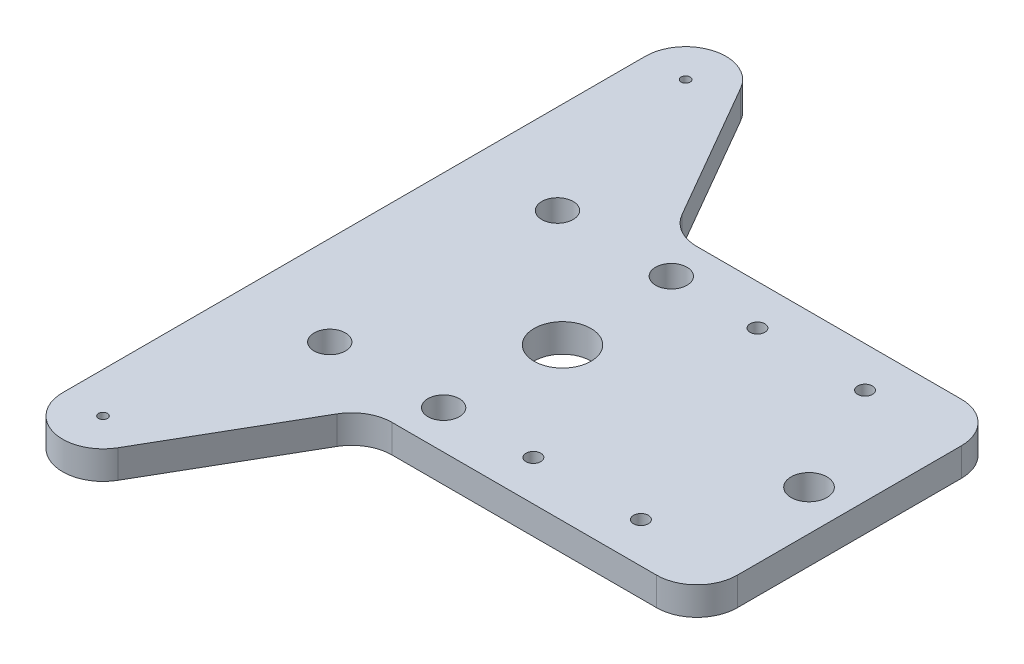
ISO-10303-21;
HEADER;
FILE_DESCRIPTION(('STEP AP214'),'2;1');
FILE_NAME('part.step','',(''),(''),'','','');
FILE_SCHEMA(('AUTOMOTIVE_DESIGN { 1 0 10303 214 1 1 1 1 }'));
ENDSEC;
DATA;
#1=APPLICATION_CONTEXT('core data for automotive mechanical design processes');
#2=APPLICATION_PROTOCOL_DEFINITION('international standard','automotive_design',2000,#1);
#3=PRODUCT_CONTEXT('',#1,'mechanical');
#4=PRODUCT('Part','Part','',(#3));
#5=PRODUCT_RELATED_PRODUCT_CATEGORY('part','',(#4));
#6=PRODUCT_DEFINITION_FORMATION('','',#4);
#7=PRODUCT_DEFINITION_CONTEXT('part definition',#1,'design');
#8=PRODUCT_DEFINITION('design','',#6,#7);
#9=PRODUCT_DEFINITION_SHAPE('','',#8);
#10=(LENGTH_UNIT() NAMED_UNIT(*) SI_UNIT(.MILLI.,.METRE.));
#11=(NAMED_UNIT(*) PLANE_ANGLE_UNIT() SI_UNIT($,.RADIAN.));
#12=(NAMED_UNIT(*) SI_UNIT($,.STERADIAN.) SOLID_ANGLE_UNIT());
#13=UNCERTAINTY_MEASURE_WITH_UNIT(LENGTH_MEASURE(1.E-05),#10,'distance_accuracy_value','');
#14=(GEOMETRIC_REPRESENTATION_CONTEXT(3) GLOBAL_UNCERTAINTY_ASSIGNED_CONTEXT((#13)) GLOBAL_UNIT_ASSIGNED_CONTEXT((#10,
#11,#12)) REPRESENTATION_CONTEXT('',''));
#15=CARTESIAN_POINT('',(0.,0.,0.));
#16=DIRECTION('',(0.,0.,1.));
#17=DIRECTION('',(1.,0.,0.));
#18=AXIS2_PLACEMENT_3D('',#15,#16,#17);
#19=CARTESIAN_POINT('',(9.,6.3,-65.));
#20=DIRECTION('',(0.,-1.,0.));
#21=DIRECTION('',(0.,0.,-1.));
#22=AXIS2_PLACEMENT_3D('',#19,#20,#21);
#23=PLANE('',#22);
#24=CARTESIAN_POINT('',(9.,6.3,-65.));
#25=DIRECTION('',(0.,1.,0.));
#26=DIRECTION('',(0.,0.,-1.));
#27=AXIS2_PLACEMENT_3D('',#24,#25,#26);
#28=CIRCLE('',#27,9.);
#29=CARTESIAN_POINT('',(16.7942286340599,6.3,-69.5));
#30=VERTEX_POINT('',#29);
#31=CARTESIAN_POINT('',(0.,6.3,-65.));
#32=VERTEX_POINT('',#31);
#33=EDGE_CURVE('E204',#30,#32,#28,.T.);
#34=ORIENTED_EDGE('',*,*,#33,.T.);
#35=DIRECTION('',(0.,0.,1.));
#36=VECTOR('',#35,1.);
#37=CARTESIAN_POINT('',(0.,6.3,65.));
#38=LINE('',#37,#36);
#39=CARTESIAN_POINT('',(0.,6.3,65.));
#40=VERTEX_POINT('',#39);
#41=EDGE_CURVE('E124',#32,#40,#38,.T.);
#42=ORIENTED_EDGE('',*,*,#41,.T.);
#43=CARTESIAN_POINT('',(9.00000000000003,6.3,65.));
#44=DIRECTION('',(0.,1.,0.));
#45=DIRECTION('',(0.,0.,1.));
#46=AXIS2_PLACEMENT_3D('',#43,#44,#45);
#47=CIRCLE('',#46,9.);
#48=CARTESIAN_POINT('',(16.79422863406,6.3,69.5));
#49=VERTEX_POINT('',#48);
#50=EDGE_CURVE('E216',#40,#49,#47,.T.);
#51=ORIENTED_EDGE('',*,*,#50,.T.);
#52=DIRECTION('',(0.500000000000003,0.,-0.866025403784437));
#53=VECTOR('',#52,1.);
#54=CARTESIAN_POINT('',(16.79422863406,6.3,69.5));
#55=LINE('',#54,#53);
#56=CARTESIAN_POINT('',(34.6920869789386,6.3,38.4999999999999));
#57=VERTEX_POINT('',#56);
#58=EDGE_CURVE('E219',#49,#57,#55,.T.);
#59=ORIENTED_EDGE('',*,*,#58,.T.);
#60=CARTESIAN_POINT('',(42.4863156129985,6.3,43.));
#61=DIRECTION('',(0.,-1.,0.));
#62=DIRECTION('',(0.,0.,-1.));
#63=AXIS2_PLACEMENT_3D('',#60,#61,#62);
#64=CIRCLE('',#63,9.);
#65=CARTESIAN_POINT('',(42.4863156129985,6.3,34.));
#66=VERTEX_POINT('',#65);
#67=EDGE_CURVE('E223',#57,#66,#64,.T.);
#68=ORIENTED_EDGE('',*,*,#67,.T.);
#69=DIRECTION('',(1.,0.,0.));
#70=VECTOR('',#69,1.);
#71=CARTESIAN_POINT('',(42.4863156129985,6.3,34.));
#72=LINE('',#71,#70);
#73=CARTESIAN_POINT('',(101.527767497326,6.3,34.));
#74=VERTEX_POINT('',#73);
#75=EDGE_CURVE('E227',#66,#74,#72,.T.);
#76=ORIENTED_EDGE('',*,*,#75,.T.);
#77=CARTESIAN_POINT('',(101.527767497326,6.3,25.));
#78=DIRECTION('',(0.,1.,0.));
#79=DIRECTION('',(0.,0.,1.));
#80=AXIS2_PLACEMENT_3D('',#77,#78,#79);
#81=CIRCLE('',#80,9.00000000000001);
#82=CARTESIAN_POINT('',(110.527767497326,6.3,24.9999999999999));
#83=VERTEX_POINT('',#82);
#84=EDGE_CURVE('E234',#74,#83,#81,.T.);
#85=ORIENTED_EDGE('',*,*,#84,.T.);
#86=DIRECTION('',(0.,0.,-1.));
#87=VECTOR('',#86,1.);
#88=CARTESIAN_POINT('',(110.527767497326,6.3,-25.));
#89=LINE('',#88,#87);
#90=CARTESIAN_POINT('',(110.527767497326,6.3,-25.));
#91=VERTEX_POINT('',#90);
#92=EDGE_CURVE('E237',#83,#91,#89,.T.);
#93=ORIENTED_EDGE('',*,*,#92,.T.);
#94=CARTESIAN_POINT('',(101.527767497326,6.3,-25.));
#95=DIRECTION('',(0.,1.,0.));
#96=DIRECTION('',(0.,0.,-1.));
#97=AXIS2_PLACEMENT_3D('',#94,#95,#96);
#98=CIRCLE('',#97,9.00000000000001);
#99=CARTESIAN_POINT('',(101.527767497326,6.3,-34.));
#100=VERTEX_POINT('',#99);
#101=EDGE_CURVE('E157',#91,#100,#98,.T.);
#102=ORIENTED_EDGE('',*,*,#101,.T.);
#103=DIRECTION('',(-1.,0.,0.));
#104=VECTOR('',#103,1.);
#105=CARTESIAN_POINT('',(42.4863156129985,6.3,-34.));
#106=LINE('',#105,#104);
#107=CARTESIAN_POINT('',(42.4863156129985,6.3,-34.));
#108=VERTEX_POINT('',#107);
#109=EDGE_CURVE('E151',#100,#108,#106,.T.);
#110=ORIENTED_EDGE('',*,*,#109,.T.);
#111=CARTESIAN_POINT('',(42.4863156129985,6.3,-43.));
#112=DIRECTION('',(0.,-1.,0.));
#113=DIRECTION('',(0.,0.,1.));
#114=AXIS2_PLACEMENT_3D('',#111,#112,#113);
#115=CIRCLE('',#114,9.);
#116=CARTESIAN_POINT('',(34.6920869789386,6.3,-38.5));
#117=VERTEX_POINT('',#116);
#118=EDGE_CURVE('E155',#108,#117,#115,.T.);
#119=ORIENTED_EDGE('',*,*,#118,.T.);
#120=DIRECTION('',(-0.500000000000004,0.,-0.866025403784436));
#121=VECTOR('',#120,1.);
#122=CARTESIAN_POINT('',(16.7942286340599,6.3,-69.5));
#123=LINE('',#122,#121);
#124=EDGE_CURVE('E65',#117,#30,#123,.T.);
#125=ORIENTED_EDGE('',*,*,#124,.T.);
#126=EDGE_LOOP('',(#34,#42,#51,#59,#68,#76,#85,#93,#102,#110,#119,#125));
#127=FACE_BOUND('',#126,.T.);
#128=CARTESIAN_POINT('',(9.,6.3,-65.));
#129=DIRECTION('',(0.,1.,0.));
#130=DIRECTION('',(0.,0.,1.));
#131=AXIS2_PLACEMENT_3D('',#128,#129,#130);
#132=CIRCLE('',#131,1.);
#133=CARTESIAN_POINT('',(9.,6.3,-64.));
#134=VERTEX_POINT('',#133);
#135=EDGE_CURVE('E191',#134,#134,#132,.T.);
#136=ORIENTED_EDGE('',*,*,#135,.F.);
#137=EDGE_LOOP('',(#136));
#138=FACE_BOUND('',#137,.T.);
#139=CARTESIAN_POINT('',(89.0277674973262,6.3,25.));
#140=DIRECTION('',(0.,1.,0.));
#141=DIRECTION('',(0.,0.,1.));
#142=AXIS2_PLACEMENT_3D('',#139,#140,#141);
#143=CIRCLE('',#142,1.65);
#144=CARTESIAN_POINT('',(89.0277674973262,6.3,26.65));
#145=VERTEX_POINT('',#144);
#146=EDGE_CURVE('E203',#145,#145,#143,.T.);
#147=ORIENTED_EDGE('',*,*,#146,.F.);
#148=EDGE_LOOP('',(#147));
#149=FACE_BOUND('',#148,.T.);
#150=CARTESIAN_POINT('',(9.00000000000003,6.3,65.));
#151=DIRECTION('',(0.,1.,0.));
#152=DIRECTION('',(0.,0.,-1.));
#153=AXIS2_PLACEMENT_3D('',#150,#151,#152);
#154=CIRCLE('',#153,1.);
#155=CARTESIAN_POINT('',(9.00000000000003,6.3,64.));
#156=VERTEX_POINT('',#155);
#157=EDGE_CURVE('E281',#156,#156,#154,.T.);
#158=ORIENTED_EDGE('',*,*,#157,.F.);
#159=EDGE_LOOP('',(#158));
#160=FACE_BOUND('',#159,.T.);
#161=CARTESIAN_POINT('',(46.5277674973261,6.3,0.));
#162=DIRECTION('',(0.,1.,0.));
#163=DIRECTION('',(0.,0.,-1.));
#164=AXIS2_PLACEMENT_3D('',#161,#162,#163);
#165=CIRCLE('',#164,6.35000000000061);
#166=CARTESIAN_POINT('',(46.5277674973261,6.3,-6.35000000000062));
#167=VERTEX_POINT('',#166);
#168=EDGE_CURVE('E288',#167,#167,#165,.T.);
#169=ORIENTED_EDGE('',*,*,#168,.F.);
#170=EDGE_LOOP('',(#169));
#171=FACE_BOUND('',#170,.T.);
#172=CARTESIAN_POINT('',(20.,6.3,-25.4));
#173=DIRECTION('',(0.,1.,0.));
#174=DIRECTION('',(0.,0.,1.));
#175=AXIS2_PLACEMENT_3D('',#172,#173,#174);
#176=CIRCLE('',#175,3.5);
#177=CARTESIAN_POINT('',(20.,6.3,-21.9));
#178=VERTEX_POINT('',#177);
#179=EDGE_CURVE('E296',#178,#178,#176,.T.);
#180=ORIENTED_EDGE('',*,*,#179,.F.);
#181=EDGE_LOOP('',(#180));
#182=FACE_BOUND('',#181,.T.);
#183=CARTESIAN_POINT('',(45.4,6.3,-25.4));
#184=DIRECTION('',(0.,1.,0.));
#185=DIRECTION('',(0.,0.,1.));
#186=AXIS2_PLACEMENT_3D('',#183,#184,#185);
#187=CIRCLE('',#186,3.5);
#188=CARTESIAN_POINT('',(45.4,6.3,-21.9));
#189=VERTEX_POINT('',#188);
#190=EDGE_CURVE('E304',#189,#189,#187,.T.);
#191=ORIENTED_EDGE('',*,*,#190,.F.);
#192=EDGE_LOOP('',(#191));
#193=FACE_BOUND('',#192,.T.);
#194=CARTESIAN_POINT('',(45.4,6.3,25.4));
#195=DIRECTION('',(0.,1.,0.));
#196=DIRECTION('',(0.,0.,-1.));
#197=AXIS2_PLACEMENT_3D('',#194,#195,#196);
#198=CIRCLE('',#197,3.5);
#199=CARTESIAN_POINT('',(45.4,6.3,21.9));
#200=VERTEX_POINT('',#199);
#201=EDGE_CURVE('E312',#200,#200,#198,.T.);
#202=ORIENTED_EDGE('',*,*,#201,.F.);
#203=EDGE_LOOP('',(#202));
#204=FACE_BOUND('',#203,.T.);
#205=CARTESIAN_POINT('',(20.,6.3,25.4));
#206=DIRECTION('',(0.,1.,0.));
#207=DIRECTION('',(0.,0.,-1.));
#208=AXIS2_PLACEMENT_3D('',#205,#206,#207);
#209=CIRCLE('',#208,3.49999999999999);
#210=CARTESIAN_POINT('',(20.,6.3,21.9));
#211=VERTEX_POINT('',#210);
#212=EDGE_CURVE('E320',#211,#211,#209,.T.);
#213=ORIENTED_EDGE('',*,*,#212,.F.);
#214=EDGE_LOOP('',(#213));
#215=FACE_BOUND('',#214,.T.);
#216=CARTESIAN_POINT('',(101.527767497326,6.3,0.));
#217=DIRECTION('',(0.,1.,0.));
#218=DIRECTION('',(0.,0.,-1.));
#219=AXIS2_PLACEMENT_3D('',#216,#217,#218);
#220=CIRCLE('',#219,4.00000000000062);
#221=CARTESIAN_POINT('',(101.527767497326,6.3,-4.00000000000065));
#222=VERTEX_POINT('',#221);
#223=EDGE_CURVE('E328',#222,#222,#220,.T.);
#224=ORIENTED_EDGE('',*,*,#223,.F.);
#225=EDGE_LOOP('',(#224));
#226=FACE_BOUND('',#225,.T.);
#227=CARTESIAN_POINT('',(65.0277674973262,6.3,25.));
#228=DIRECTION('',(0.,1.,0.));
#229=DIRECTION('',(0.,0.,1.));
#230=AXIS2_PLACEMENT_3D('',#227,#228,#229);
#231=CIRCLE('',#230,1.65);
#232=CARTESIAN_POINT('',(65.0277674973262,6.3,26.65));
#233=VERTEX_POINT('',#232);
#234=EDGE_CURVE('E336',#233,#233,#231,.T.);
#235=ORIENTED_EDGE('',*,*,#234,.F.);
#236=EDGE_LOOP('',(#235));
#237=FACE_BOUND('',#236,.T.);
#238=CARTESIAN_POINT('',(65.0277674973261,6.3,-25.));
#239=DIRECTION('',(0.,1.,0.));
#240=DIRECTION('',(0.,0.,-1.));
#241=AXIS2_PLACEMENT_3D('',#238,#239,#240);
#242=CIRCLE('',#241,1.65);
#243=CARTESIAN_POINT('',(65.0277674973261,6.3,-26.65));
#244=VERTEX_POINT('',#243);
#245=EDGE_CURVE('E344',#244,#244,#242,.T.);
#246=ORIENTED_EDGE('',*,*,#245,.F.);
#247=EDGE_LOOP('',(#246));
#248=FACE_BOUND('',#247,.T.);
#249=CARTESIAN_POINT('',(89.0277674973261,6.3,-25.));
#250=DIRECTION('',(0.,1.,0.));
#251=DIRECTION('',(0.,0.,-1.));
#252=AXIS2_PLACEMENT_3D('',#249,#250,#251);
#253=CIRCLE('',#252,1.65);
#254=CARTESIAN_POINT('',(89.0277674973261,6.3,-26.65));
#255=VERTEX_POINT('',#254);
#256=EDGE_CURVE('E352',#255,#255,#253,.T.);
#257=ORIENTED_EDGE('',*,*,#256,.F.);
#258=EDGE_LOOP('',(#257));
#259=FACE_BOUND('',#258,.T.);
#260=ADVANCED_FACE('F44',(#127,#138,#149,#160,#171,#182,#193,#204,#215,#226,#237,#248,#259),#23,.F.);
#261=CARTESIAN_POINT('',(9.,0.,-65.));
#262=DIRECTION('',(0.,-1.,0.));
#263=DIRECTION('',(0.,0.,-1.));
#264=AXIS2_PLACEMENT_3D('',#261,#262,#263);
#265=PLANE('',#264);
#266=CARTESIAN_POINT('',(65.0277674973261,0.,-25.));
#267=DIRECTION('',(0.,1.,0.));
#268=DIRECTION('',(0.,0.,-1.));
#269=AXIS2_PLACEMENT_3D('',#266,#267,#268);
#270=CIRCLE('',#269,1.65);
#271=CARTESIAN_POINT('',(65.0277674973261,0.,-26.65));
#272=VERTEX_POINT('',#271);
#273=EDGE_CURVE('E348',#272,#272,#270,.T.);
#274=ORIENTED_EDGE('',*,*,#273,.T.);
#275=EDGE_LOOP('',(#274));
#276=FACE_BOUND('',#275,.T.);
#277=CARTESIAN_POINT('',(101.527767497326,0.,0.));
#278=DIRECTION('',(0.,1.,0.));
#279=DIRECTION('',(0.,0.,-1.));
#280=AXIS2_PLACEMENT_3D('',#277,#278,#279);
#281=CIRCLE('',#280,4.00000000000062);
#282=CARTESIAN_POINT('',(101.527767497326,0.,-4.00000000000065));
#283=VERTEX_POINT('',#282);
#284=EDGE_CURVE('E332',#283,#283,#281,.T.);
#285=ORIENTED_EDGE('',*,*,#284,.T.);
#286=EDGE_LOOP('',(#285));
#287=FACE_BOUND('',#286,.T.);
#288=CARTESIAN_POINT('',(45.4,0.,25.4));
#289=DIRECTION('',(0.,1.,0.));
#290=DIRECTION('',(0.,0.,-1.));
#291=AXIS2_PLACEMENT_3D('',#288,#289,#290);
#292=CIRCLE('',#291,3.5);
#293=CARTESIAN_POINT('',(45.4,0.,21.9));
#294=VERTEX_POINT('',#293);
#295=EDGE_CURVE('E316',#294,#294,#292,.T.);
#296=ORIENTED_EDGE('',*,*,#295,.T.);
#297=EDGE_LOOP('',(#296));
#298=FACE_BOUND('',#297,.T.);
#299=CARTESIAN_POINT('',(20.,0.,-25.4));
#300=DIRECTION('',(0.,1.,0.));
#301=DIRECTION('',(0.,0.,1.));
#302=AXIS2_PLACEMENT_3D('',#299,#300,#301);
#303=CIRCLE('',#302,3.5);
#304=CARTESIAN_POINT('',(20.,0.,-21.9));
#305=VERTEX_POINT('',#304);
#306=EDGE_CURVE('E300',#305,#305,#303,.T.);
#307=ORIENTED_EDGE('',*,*,#306,.T.);
#308=EDGE_LOOP('',(#307));
#309=FACE_BOUND('',#308,.T.);
#310=CARTESIAN_POINT('',(9.00000000000003,0.,65.));
#311=DIRECTION('',(0.,1.,0.));
#312=DIRECTION('',(0.,0.,-1.));
#313=AXIS2_PLACEMENT_3D('',#310,#311,#312);
#314=CIRCLE('',#313,1.);
#315=CARTESIAN_POINT('',(9.00000000000003,0.,64.));
#316=VERTEX_POINT('',#315);
#317=EDGE_CURVE('E284',#316,#316,#314,.T.);
#318=ORIENTED_EDGE('',*,*,#317,.T.);
#319=EDGE_LOOP('',(#318));
#320=FACE_BOUND('',#319,.T.);
#321=CARTESIAN_POINT('',(9.,0.,-65.));
#322=DIRECTION('',(0.,1.,0.));
#323=DIRECTION('',(0.,0.,1.));
#324=AXIS2_PLACEMENT_3D('',#321,#322,#323);
#325=CIRCLE('',#324,1.);
#326=CARTESIAN_POINT('',(9.,0.,-64.));
#327=VERTEX_POINT('',#326);
#328=EDGE_CURVE('E198',#327,#327,#325,.T.);
#329=ORIENTED_EDGE('',*,*,#328,.T.);
#330=EDGE_LOOP('',(#329));
#331=FACE_BOUND('',#330,.T.);
#332=CARTESIAN_POINT('',(9.,0.,-65.));
#333=DIRECTION('',(0.,1.,0.));
#334=DIRECTION('',(0.,0.,-1.));
#335=AXIS2_PLACEMENT_3D('',#332,#333,#334);
#336=CIRCLE('',#335,9.);
#337=CARTESIAN_POINT('',(16.7942286340599,0.,-69.5));
#338=VERTEX_POINT('',#337);
#339=CARTESIAN_POINT('',(0.,0.,-65.));
#340=VERTEX_POINT('',#339);
#341=EDGE_CURVE('E197',#338,#340,#336,.T.);
#342=ORIENTED_EDGE('',*,*,#341,.F.);
#343=DIRECTION('',(-0.500000000000004,0.,-0.866025403784436));
#344=VECTOR('',#343,1.);
#345=CARTESIAN_POINT('',(16.7942286340599,0.,-69.5));
#346=LINE('',#345,#344);
#347=CARTESIAN_POINT('',(34.6920869789386,0.,-38.5));
#348=VERTEX_POINT('',#347);
#349=EDGE_CURVE('E116',#348,#338,#346,.T.);
#350=ORIENTED_EDGE('',*,*,#349,.F.);
#351=CARTESIAN_POINT('',(42.4863156129985,0.,-43.));
#352=DIRECTION('',(0.,-1.,0.));
#353=DIRECTION('',(0.,0.,1.));
#354=AXIS2_PLACEMENT_3D('',#351,#352,#353);
#355=CIRCLE('',#354,9.);
#356=CARTESIAN_POINT('',(42.4863156129985,0.,-34.));
#357=VERTEX_POINT('',#356);
#358=EDGE_CURVE('E110',#357,#348,#355,.T.);
#359=ORIENTED_EDGE('',*,*,#358,.F.);
#360=DIRECTION('',(-1.,0.,0.));
#361=VECTOR('',#360,1.);
#362=CARTESIAN_POINT('',(42.4863156129985,0.,-34.));
#363=LINE('',#362,#361);
#364=CARTESIAN_POINT('',(101.527767497326,0.,-34.));
#365=VERTEX_POINT('',#364);
#366=EDGE_CURVE('E166',#365,#357,#363,.T.);
#367=ORIENTED_EDGE('',*,*,#366,.F.);
#368=CARTESIAN_POINT('',(101.527767497326,0.,-25.));
#369=DIRECTION('',(0.,1.,0.));
#370=DIRECTION('',(0.,0.,-1.));
#371=AXIS2_PLACEMENT_3D('',#368,#369,#370);
#372=CIRCLE('',#371,9.00000000000001);
#373=CARTESIAN_POINT('',(110.527767497326,0.,-25.));
#374=VERTEX_POINT('',#373);
#375=EDGE_CURVE('E250',#374,#365,#372,.T.);
#376=ORIENTED_EDGE('',*,*,#375,.F.);
#377=DIRECTION('',(0.,0.,-1.));
#378=VECTOR('',#377,1.);
#379=CARTESIAN_POINT('',(110.527767497326,0.,-25.));
#380=LINE('',#379,#378);
#381=CARTESIAN_POINT('',(110.527767497326,0.,24.9999999999999));
#382=VERTEX_POINT('',#381);
#383=EDGE_CURVE('E253',#382,#374,#380,.T.);
#384=ORIENTED_EDGE('',*,*,#383,.F.);
#385=CARTESIAN_POINT('',(101.527767497326,0.,25.));
#386=DIRECTION('',(0.,1.,0.));
#387=DIRECTION('',(0.,0.,1.));
#388=AXIS2_PLACEMENT_3D('',#385,#386,#387);
#389=CIRCLE('',#388,9.00000000000001);
#390=CARTESIAN_POINT('',(101.527767497326,0.,34.));
#391=VERTEX_POINT('',#390);
#392=EDGE_CURVE('E256',#391,#382,#389,.T.);
#393=ORIENTED_EDGE('',*,*,#392,.F.);
#394=DIRECTION('',(1.,0.,0.));
#395=VECTOR('',#394,1.);
#396=CARTESIAN_POINT('',(42.4863156129985,0.,34.));
#397=LINE('',#396,#395);
#398=CARTESIAN_POINT('',(42.4863156129985,0.,34.));
#399=VERTEX_POINT('',#398);
#400=EDGE_CURVE('E259',#399,#391,#397,.T.);
#401=ORIENTED_EDGE('',*,*,#400,.F.);
#402=CARTESIAN_POINT('',(42.4863156129985,0.,43.));
#403=DIRECTION('',(0.,-1.,0.));
#404=DIRECTION('',(0.,0.,-1.));
#405=AXIS2_PLACEMENT_3D('',#402,#403,#404);
#406=CIRCLE('',#405,9.);
#407=CARTESIAN_POINT('',(34.6920869789386,0.,38.4999999999999));
#408=VERTEX_POINT('',#407);
#409=EDGE_CURVE('E262',#408,#399,#406,.T.);
#410=ORIENTED_EDGE('',*,*,#409,.F.);
#411=DIRECTION('',(0.500000000000003,0.,-0.866025403784437));
#412=VECTOR('',#411,1.);
#413=CARTESIAN_POINT('',(16.79422863406,0.,69.5));
#414=LINE('',#413,#412);
#415=CARTESIAN_POINT('',(16.79422863406,0.,69.5));
#416=VERTEX_POINT('',#415);
#417=EDGE_CURVE('E265',#416,#408,#414,.T.);
#418=ORIENTED_EDGE('',*,*,#417,.F.);
#419=CARTESIAN_POINT('',(9.00000000000003,0.,65.));
#420=DIRECTION('',(0.,1.,0.));
#421=DIRECTION('',(0.,0.,1.));
#422=AXIS2_PLACEMENT_3D('',#419,#420,#421);
#423=CIRCLE('',#422,9.);
#424=CARTESIAN_POINT('',(0.,0.,65.));
#425=VERTEX_POINT('',#424);
#426=EDGE_CURVE('E268',#425,#416,#423,.T.);
#427=ORIENTED_EDGE('',*,*,#426,.F.);
#428=DIRECTION('',(0.,0.,1.));
#429=VECTOR('',#428,1.);
#430=CARTESIAN_POINT('',(0.,0.,65.));
#431=LINE('',#430,#429);
#432=EDGE_CURVE('E271',#340,#425,#431,.T.);
#433=ORIENTED_EDGE('',*,*,#432,.F.);
#434=EDGE_LOOP('',(#342,#350,#359,#367,#376,#384,#393,#401,#410,#418,#427,#433));
#435=FACE_BOUND('',#434,.T.);
#436=CARTESIAN_POINT('',(89.0277674973262,0.,25.));
#437=DIRECTION('',(0.,1.,0.));
#438=DIRECTION('',(0.,0.,1.));
#439=AXIS2_PLACEMENT_3D('',#436,#437,#438);
#440=CIRCLE('',#439,1.65);
#441=CARTESIAN_POINT('',(89.0277674973262,0.,26.65));
#442=VERTEX_POINT('',#441);
#443=EDGE_CURVE('E199',#442,#442,#440,.T.);
#444=ORIENTED_EDGE('',*,*,#443,.T.);
#445=EDGE_LOOP('',(#444));
#446=FACE_BOUND('',#445,.T.);
#447=CARTESIAN_POINT('',(46.5277674973261,0.,0.));
#448=DIRECTION('',(0.,1.,0.));
#449=DIRECTION('',(0.,0.,-1.));
#450=AXIS2_PLACEMENT_3D('',#447,#448,#449);
#451=CIRCLE('',#450,6.35000000000061);
#452=CARTESIAN_POINT('',(46.5277674973261,0.,-6.35000000000062));
#453=VERTEX_POINT('',#452);
#454=EDGE_CURVE('E292',#453,#453,#451,.T.);
#455=ORIENTED_EDGE('',*,*,#454,.T.);
#456=EDGE_LOOP('',(#455));
#457=FACE_BOUND('',#456,.T.);
#458=CARTESIAN_POINT('',(45.4,0.,-25.4));
#459=DIRECTION('',(0.,1.,0.));
#460=DIRECTION('',(0.,0.,1.));
#461=AXIS2_PLACEMENT_3D('',#458,#459,#460);
#462=CIRCLE('',#461,3.5);
#463=CARTESIAN_POINT('',(45.4,0.,-21.9));
#464=VERTEX_POINT('',#463);
#465=EDGE_CURVE('E308',#464,#464,#462,.T.);
#466=ORIENTED_EDGE('',*,*,#465,.T.);
#467=EDGE_LOOP('',(#466));
#468=FACE_BOUND('',#467,.T.);
#469=CARTESIAN_POINT('',(20.,0.,25.4));
#470=DIRECTION('',(0.,1.,0.));
#471=DIRECTION('',(0.,0.,-1.));
#472=AXIS2_PLACEMENT_3D('',#469,#470,#471);
#473=CIRCLE('',#472,3.49999999999999);
#474=CARTESIAN_POINT('',(20.,0.,21.9));
#475=VERTEX_POINT('',#474);
#476=EDGE_CURVE('E324',#475,#475,#473,.T.);
#477=ORIENTED_EDGE('',*,*,#476,.T.);
#478=EDGE_LOOP('',(#477));
#479=FACE_BOUND('',#478,.T.);
#480=CARTESIAN_POINT('',(65.0277674973262,0.,25.));
#481=DIRECTION('',(0.,1.,0.));
#482=DIRECTION('',(0.,0.,1.));
#483=AXIS2_PLACEMENT_3D('',#480,#481,#482);
#484=CIRCLE('',#483,1.65);
#485=CARTESIAN_POINT('',(65.0277674973262,0.,26.65));
#486=VERTEX_POINT('',#485);
#487=EDGE_CURVE('E340',#486,#486,#484,.T.);
#488=ORIENTED_EDGE('',*,*,#487,.T.);
#489=EDGE_LOOP('',(#488));
#490=FACE_BOUND('',#489,.T.);
#491=CARTESIAN_POINT('',(89.0277674973261,0.,-25.));
#492=DIRECTION('',(0.,1.,0.));
#493=DIRECTION('',(0.,0.,-1.));
#494=AXIS2_PLACEMENT_3D('',#491,#492,#493);
#495=CIRCLE('',#494,1.65);
#496=CARTESIAN_POINT('',(89.0277674973261,0.,-26.65));
#497=VERTEX_POINT('',#496);
#498=EDGE_CURVE('E356',#497,#497,#495,.T.);
#499=ORIENTED_EDGE('',*,*,#498,.T.);
#500=EDGE_LOOP('',(#499));
#501=FACE_BOUND('',#500,.T.);
#502=ADVANCED_FACE('F379',(#276,#287,#298,#309,#320,#331,#435,#446,#457,#468,#479,#490,#501),
#265,.T.);
#503=CARTESIAN_POINT('',(9.,6.3,-65.));
#504=DIRECTION('',(0.,-1.,0.));
#505=DIRECTION('',(0.,0.,-1.));
#506=AXIS2_PLACEMENT_3D('',#503,#504,#505);
#507=CYLINDRICAL_SURFACE('',#506,9.);
#508=ORIENTED_EDGE('',*,*,#341,.T.);
#509=DIRECTION('',(0.,-1.,0.));
#510=VECTOR('',#509,1.);
#511=CARTESIAN_POINT('',(0.,6.3,-65.));
#512=LINE('',#511,#510);
#513=EDGE_CURVE('E12',#32,#340,#512,.T.);
#514=ORIENTED_EDGE('',*,*,#513,.F.);
#515=ORIENTED_EDGE('',*,*,#33,.F.);
#516=DIRECTION('',(0.,-1.,0.));
#517=VECTOR('',#516,1.);
#518=CARTESIAN_POINT('',(16.7942286340599,6.3,-69.5));
#519=LINE('',#518,#517);
#520=EDGE_CURVE('E175',#30,#338,#519,.T.);
#521=ORIENTED_EDGE('',*,*,#520,.T.);
#522=EDGE_LOOP('',(#508,#514,#515,#521));
#523=FACE_BOUND('',#522,.T.);
#524=ADVANCED_FACE('F46',(#523),#507,.T.);
#525=CARTESIAN_POINT('',(0.,6.3,65.));
#526=DIRECTION('',(1.,0.,0.));
#527=DIRECTION('',(0.,0.,-1.));
#528=AXIS2_PLACEMENT_3D('',#525,#526,#527);
#529=PLANE('',#528);
#530=ORIENTED_EDGE('',*,*,#432,.T.);
#531=DIRECTION('',(0.,-1.,0.));
#532=VECTOR('',#531,1.);
#533=CARTESIAN_POINT('',(0.,6.3,65.));
#534=LINE('',#533,#532);
#535=EDGE_CURVE('E54',#40,#425,#534,.T.);
#536=ORIENTED_EDGE('',*,*,#535,.F.);
#537=ORIENTED_EDGE('',*,*,#41,.F.);
#538=ORIENTED_EDGE('',*,*,#513,.T.);
#539=EDGE_LOOP('',(#530,#536,#537,#538));
#540=FACE_BOUND('',#539,.T.);
#541=ADVANCED_FACE('F436',(#540),#529,.F.);
#542=CARTESIAN_POINT('',(9.00000000000003,6.3,65.));
#543=DIRECTION('',(0.,-1.,0.));
#544=DIRECTION('',(0.,0.,-1.));
#545=AXIS2_PLACEMENT_3D('',#542,#543,#544);
#546=CYLINDRICAL_SURFACE('',#545,9.);
#547=ORIENTED_EDGE('',*,*,#426,.T.);
#548=DIRECTION('',(0.,-1.,0.));
#549=VECTOR('',#548,1.);
#550=CARTESIAN_POINT('',(16.79422863406,6.3,69.5));
#551=LINE('',#550,#549);
#552=EDGE_CURVE('E452',#49,#416,#551,.T.);
#553=ORIENTED_EDGE('',*,*,#552,.F.);
#554=ORIENTED_EDGE('',*,*,#50,.F.);
#555=ORIENTED_EDGE('',*,*,#535,.T.);
#556=EDGE_LOOP('',(#547,#553,#554,#555));
#557=FACE_BOUND('',#556,.T.);
#558=ADVANCED_FACE('F433',(#557),#546,.T.);
#559=CARTESIAN_POINT('',(16.79422863406,6.3,69.5));
#560=DIRECTION('',(-0.866025403784437,0.,-0.500000000000004));
#561=DIRECTION('',(-0.500000000000004,0.,0.866025403784437));
#562=AXIS2_PLACEMENT_3D('',#559,#560,#561);
#563=PLANE('',#562);
#564=ORIENTED_EDGE('',*,*,#417,.T.);
#565=DIRECTION('',(0.,-1.,0.));
#566=VECTOR('',#565,1.);
#567=CARTESIAN_POINT('',(34.6920869789386,6.3,38.4999999999999));
#568=LINE('',#567,#566);
#569=EDGE_CURVE('E460',#57,#408,#568,.T.);
#570=ORIENTED_EDGE('',*,*,#569,.F.);
#571=ORIENTED_EDGE('',*,*,#58,.F.);
#572=ORIENTED_EDGE('',*,*,#552,.T.);
#573=EDGE_LOOP('',(#564,#570,#571,#572));
#574=FACE_BOUND('',#573,.T.);
#575=ADVANCED_FACE('F429',(#574),#563,.F.);
#576=CARTESIAN_POINT('',(42.4863156129985,6.3,43.));
#577=DIRECTION('',(0.,-1.,0.));
#578=DIRECTION('',(0.,0.,-1.));
#579=AXIS2_PLACEMENT_3D('',#576,#577,#578);
#580=CYLINDRICAL_SURFACE('',#579,9.);
#581=ORIENTED_EDGE('',*,*,#409,.T.);
#582=DIRECTION('',(0.,-1.,0.));
#583=VECTOR('',#582,1.);
#584=CARTESIAN_POINT('',(42.4863156129985,6.3,34.));
#585=LINE('',#584,#583);
#586=EDGE_CURVE('E465',#66,#399,#585,.T.);
#587=ORIENTED_EDGE('',*,*,#586,.F.);
#588=ORIENTED_EDGE('',*,*,#67,.F.);
#589=ORIENTED_EDGE('',*,*,#569,.T.);
#590=EDGE_LOOP('',(#581,#587,#588,#589));
#591=FACE_BOUND('',#590,.T.);
#592=ADVANCED_FACE('F425',(#591),#580,.F.);
#593=CARTESIAN_POINT('',(42.4863156129985,6.3,34.));
#594=DIRECTION('',(0.,0.,-1.));
#595=DIRECTION('',(-1.,0.,0.));
#596=AXIS2_PLACEMENT_3D('',#593,#594,#595);
#597=PLANE('',#596);
#598=ORIENTED_EDGE('',*,*,#400,.T.);
#599=DIRECTION('',(0.,-1.,0.));
#600=VECTOR('',#599,1.);
#601=CARTESIAN_POINT('',(101.527767497326,6.3,34.));
#602=LINE('',#601,#600);
#603=EDGE_CURVE('E470',#74,#391,#602,.T.);
#604=ORIENTED_EDGE('',*,*,#603,.F.);
#605=ORIENTED_EDGE('',*,*,#75,.F.);
#606=ORIENTED_EDGE('',*,*,#586,.T.);
#607=EDGE_LOOP('',(#598,#604,#605,#606));
#608=FACE_BOUND('',#607,.T.);
#609=ADVANCED_FACE('F421',(#608),#597,.F.);
#610=CARTESIAN_POINT('',(101.527767497326,6.3,25.));
#611=DIRECTION('',(0.,-1.,0.));
#612=DIRECTION('',(0.,0.,-1.));
#613=AXIS2_PLACEMENT_3D('',#610,#611,#612);
#614=CYLINDRICAL_SURFACE('',#613,9.00000000000001);
#615=ORIENTED_EDGE('',*,*,#392,.T.);
#616=DIRECTION('',(0.,-1.,0.));
#617=VECTOR('',#616,1.);
#618=CARTESIAN_POINT('',(110.527767497326,6.3,24.9999999999999));
#619=LINE('',#618,#617);
#620=EDGE_CURVE('E476',#83,#382,#619,.T.);
#621=ORIENTED_EDGE('',*,*,#620,.F.);
#622=ORIENTED_EDGE('',*,*,#84,.F.);
#623=ORIENTED_EDGE('',*,*,#603,.T.);
#624=EDGE_LOOP('',(#615,#621,#622,#623));
#625=FACE_BOUND('',#624,.T.);
#626=ADVANCED_FACE('F417',(#625),#614,.T.);
#627=CARTESIAN_POINT('',(110.527767497326,6.3,-25.));
#628=DIRECTION('',(-1.,0.,0.));
#629=DIRECTION('',(0.,0.,1.));
#630=AXIS2_PLACEMENT_3D('',#627,#628,#629);
#631=PLANE('',#630);
#632=ORIENTED_EDGE('',*,*,#383,.T.);
#633=DIRECTION('',(0.,-1.,0.));
#634=VECTOR('',#633,1.);
#635=CARTESIAN_POINT('',(110.527767497326,6.3,-25.));
#636=LINE('',#635,#634);
#637=EDGE_CURVE('E480',#91,#374,#636,.T.);
#638=ORIENTED_EDGE('',*,*,#637,.F.);
#639=ORIENTED_EDGE('',*,*,#92,.F.);
#640=ORIENTED_EDGE('',*,*,#620,.T.);
#641=EDGE_LOOP('',(#632,#638,#639,#640));
#642=FACE_BOUND('',#641,.T.);
#643=ADVANCED_FACE('F413',(#642),#631,.F.);
#644=CARTESIAN_POINT('',(101.527767497326,6.3,-25.));
#645=DIRECTION('',(0.,-1.,0.));
#646=DIRECTION('',(0.,0.,-1.));
#647=AXIS2_PLACEMENT_3D('',#644,#645,#646);
#648=CYLINDRICAL_SURFACE('',#647,9.00000000000001);
#649=ORIENTED_EDGE('',*,*,#375,.T.);
#650=DIRECTION('',(0.,-1.,0.));
#651=VECTOR('',#650,1.);
#652=CARTESIAN_POINT('',(101.527767497326,6.3,-34.));
#653=LINE('',#652,#651);
#654=EDGE_CURVE('E168',#100,#365,#653,.T.);
#655=ORIENTED_EDGE('',*,*,#654,.F.);
#656=ORIENTED_EDGE('',*,*,#101,.F.);
#657=ORIENTED_EDGE('',*,*,#637,.T.);
#658=EDGE_LOOP('',(#649,#655,#656,#657));
#659=FACE_BOUND('',#658,.T.);
#660=ADVANCED_FACE('F410',(#659),#648,.T.);
#661=CARTESIAN_POINT('',(42.4863156129985,6.3,-34.));
#662=DIRECTION('',(0.,0.,1.));
#663=DIRECTION('',(1.,0.,0.));
#664=AXIS2_PLACEMENT_3D('',#661,#662,#663);
#665=PLANE('',#664);
#666=ORIENTED_EDGE('',*,*,#366,.T.);
#667=DIRECTION('',(0.,-1.,0.));
#668=VECTOR('',#667,1.);
#669=CARTESIAN_POINT('',(42.4863156129985,6.3,-34.));
#670=LINE('',#669,#668);
#671=EDGE_CURVE('E163',#108,#357,#670,.T.);
#672=ORIENTED_EDGE('',*,*,#671,.F.);
#673=ORIENTED_EDGE('',*,*,#109,.F.);
#674=ORIENTED_EDGE('',*,*,#654,.T.);
#675=EDGE_LOOP('',(#666,#672,#673,#674));
#676=FACE_BOUND('',#675,.T.);
#677=ADVANCED_FACE('F164',(#676),#665,.F.);
#678=CARTESIAN_POINT('',(42.4863156129985,6.3,-43.));
#679=DIRECTION('',(0.,-1.,0.));
#680=DIRECTION('',(0.,0.,-1.));
#681=AXIS2_PLACEMENT_3D('',#678,#679,#680);
#682=CYLINDRICAL_SURFACE('',#681,9.);
#683=ORIENTED_EDGE('',*,*,#358,.T.);
#684=DIRECTION('',(0.,-1.,0.));
#685=VECTOR('',#684,1.);
#686=CARTESIAN_POINT('',(34.6920869789386,6.3,-38.5));
#687=LINE('',#686,#685);
#688=EDGE_CURVE('E169',#117,#348,#687,.T.);
#689=ORIENTED_EDGE('',*,*,#688,.F.);
#690=ORIENTED_EDGE('',*,*,#118,.F.);
#691=ORIENTED_EDGE('',*,*,#671,.T.);
#692=EDGE_LOOP('',(#683,#689,#690,#691));
#693=FACE_BOUND('',#692,.T.);
#694=ADVANCED_FACE('F171',(#693),#682,.F.);
#695=CARTESIAN_POINT('',(16.7942286340599,6.3,-69.5));
#696=DIRECTION('',(-0.866025403784436,0.,0.500000000000004));
#697=DIRECTION('',(0.500000000000004,0.,0.866025403784436));
#698=AXIS2_PLACEMENT_3D('',#695,#696,#697);
#699=PLANE('',#698);
#700=ORIENTED_EDGE('',*,*,#349,.T.);
#701=ORIENTED_EDGE('',*,*,#520,.F.);
#702=ORIENTED_EDGE('',*,*,#124,.F.);
#703=ORIENTED_EDGE('',*,*,#688,.T.);
#704=EDGE_LOOP('',(#700,#701,#702,#703));
#705=FACE_BOUND('',#704,.T.);
#706=ADVANCED_FACE('F403',(#705),#699,.F.);
#707=CARTESIAN_POINT('',(9.,6.3,-65.));
#708=DIRECTION('',(0.,-1.,0.));
#709=DIRECTION('',(0.,0.,-1.));
#710=AXIS2_PLACEMENT_3D('',#707,#708,#709);
#711=CYLINDRICAL_SURFACE('',#710,1.);
#712=ORIENTED_EDGE('',*,*,#135,.T.);
#713=EDGE_LOOP('',(#712));
#714=FACE_BOUND('',#713,.T.);
#715=ORIENTED_EDGE('',*,*,#328,.F.);
#716=EDGE_LOOP('',(#715));
#717=FACE_BOUND('',#716,.T.);
#718=ADVANCED_FACE('F400',(#714,#717),#711,.F.);
#719=CARTESIAN_POINT('',(89.0277674973262,6.3,25.));
#720=DIRECTION('',(0.,-1.,0.));
#721=DIRECTION('',(0.,0.,-1.));
#722=AXIS2_PLACEMENT_3D('',#719,#720,#721);
#723=CYLINDRICAL_SURFACE('',#722,1.65);
#724=ORIENTED_EDGE('',*,*,#146,.T.);
#725=EDGE_LOOP('',(#724));
#726=FACE_BOUND('',#725,.T.);
#727=ORIENTED_EDGE('',*,*,#443,.F.);
#728=EDGE_LOOP('',(#727));
#729=FACE_BOUND('',#728,.T.);
#730=ADVANCED_FACE('F541',(#726,#729),#723,.F.);
#731=CARTESIAN_POINT('',(9.00000000000003,6.3,65.));
#732=DIRECTION('',(0.,-1.,0.));
#733=DIRECTION('',(0.,0.,-1.));
#734=AXIS2_PLACEMENT_3D('',#731,#732,#733);
#735=CYLINDRICAL_SURFACE('',#734,1.);
#736=ORIENTED_EDGE('',*,*,#157,.T.);
#737=EDGE_LOOP('',(#736));
#738=FACE_BOUND('',#737,.T.);
#739=ORIENTED_EDGE('',*,*,#317,.F.);
#740=EDGE_LOOP('',(#739));
#741=FACE_BOUND('',#740,.T.);
#742=ADVANCED_FACE('F538',(#738,#741),#735,.F.);
#743=CARTESIAN_POINT('',(46.5277674973261,6.3,0.));
#744=DIRECTION('',(0.,-1.,0.));
#745=DIRECTION('',(0.,0.,-1.));
#746=AXIS2_PLACEMENT_3D('',#743,#744,#745);
#747=CYLINDRICAL_SURFACE('',#746,6.35000000000061);
#748=ORIENTED_EDGE('',*,*,#168,.T.);
#749=EDGE_LOOP('',(#748));
#750=FACE_BOUND('',#749,.T.);
#751=ORIENTED_EDGE('',*,*,#454,.F.);
#752=EDGE_LOOP('',(#751));
#753=FACE_BOUND('',#752,.T.);
#754=ADVANCED_FACE('F534',(#750,#753),#747,.F.);
#755=CARTESIAN_POINT('',(20.,6.3,-25.4));
#756=DIRECTION('',(0.,-1.,0.));
#757=DIRECTION('',(0.,0.,-1.));
#758=AXIS2_PLACEMENT_3D('',#755,#756,#757);
#759=CYLINDRICAL_SURFACE('',#758,3.5);
#760=ORIENTED_EDGE('',*,*,#179,.T.);
#761=EDGE_LOOP('',(#760));
#762=FACE_BOUND('',#761,.T.);
#763=ORIENTED_EDGE('',*,*,#306,.F.);
#764=EDGE_LOOP('',(#763));
#765=FACE_BOUND('',#764,.T.);
#766=ADVANCED_FACE('F530',(#762,#765),#759,.F.);
#767=CARTESIAN_POINT('',(45.4,6.3,-25.4));
#768=DIRECTION('',(0.,-1.,0.));
#769=DIRECTION('',(0.,0.,-1.));
#770=AXIS2_PLACEMENT_3D('',#767,#768,#769);
#771=CYLINDRICAL_SURFACE('',#770,3.5);
#772=ORIENTED_EDGE('',*,*,#190,.T.);
#773=EDGE_LOOP('',(#772));
#774=FACE_BOUND('',#773,.T.);
#775=ORIENTED_EDGE('',*,*,#465,.F.);
#776=EDGE_LOOP('',(#775));
#777=FACE_BOUND('',#776,.T.);
#778=ADVANCED_FACE('F526',(#774,#777),#771,.F.);
#779=CARTESIAN_POINT('',(45.4,6.3,25.4));
#780=DIRECTION('',(0.,-1.,0.));
#781=DIRECTION('',(0.,0.,-1.));
#782=AXIS2_PLACEMENT_3D('',#779,#780,#781);
#783=CYLINDRICAL_SURFACE('',#782,3.5);
#784=ORIENTED_EDGE('',*,*,#201,.T.);
#785=EDGE_LOOP('',(#784));
#786=FACE_BOUND('',#785,.T.);
#787=ORIENTED_EDGE('',*,*,#295,.F.);
#788=EDGE_LOOP('',(#787));
#789=FACE_BOUND('',#788,.T.);
#790=ADVANCED_FACE('F522',(#786,#789),#783,.F.);
#791=CARTESIAN_POINT('',(20.,6.3,25.4));
#792=DIRECTION('',(0.,-1.,0.));
#793=DIRECTION('',(0.,0.,-1.));
#794=AXIS2_PLACEMENT_3D('',#791,#792,#793);
#795=CYLINDRICAL_SURFACE('',#794,3.49999999999999);
#796=ORIENTED_EDGE('',*,*,#212,.T.);
#797=EDGE_LOOP('',(#796));
#798=FACE_BOUND('',#797,.T.);
#799=ORIENTED_EDGE('',*,*,#476,.F.);
#800=EDGE_LOOP('',(#799));
#801=FACE_BOUND('',#800,.T.);
#802=ADVANCED_FACE('F516',(#798,#801),#795,.F.);
#803=CARTESIAN_POINT('',(101.527767497326,6.3,0.));
#804=DIRECTION('',(0.,-1.,0.));
#805=DIRECTION('',(0.,0.,-1.));
#806=AXIS2_PLACEMENT_3D('',#803,#804,#805);
#807=CYLINDRICAL_SURFACE('',#806,4.00000000000062);
#808=ORIENTED_EDGE('',*,*,#223,.T.);
#809=EDGE_LOOP('',(#808));
#810=FACE_BOUND('',#809,.T.);
#811=ORIENTED_EDGE('',*,*,#284,.F.);
#812=EDGE_LOOP('',(#811));
#813=FACE_BOUND('',#812,.T.);
#814=ADVANCED_FACE('F510',(#810,#813),#807,.F.);
#815=CARTESIAN_POINT('',(65.0277674973262,6.3,25.));
#816=DIRECTION('',(0.,-1.,0.));
#817=DIRECTION('',(0.,0.,-1.));
#818=AXIS2_PLACEMENT_3D('',#815,#816,#817);
#819=CYLINDRICAL_SURFACE('',#818,1.65);
#820=ORIENTED_EDGE('',*,*,#234,.T.);
#821=EDGE_LOOP('',(#820));
#822=FACE_BOUND('',#821,.T.);
#823=ORIENTED_EDGE('',*,*,#487,.F.);
#824=EDGE_LOOP('',(#823));
#825=FACE_BOUND('',#824,.T.);
#826=ADVANCED_FACE('F389',(#822,#825),#819,.F.);
#827=CARTESIAN_POINT('',(65.0277674973261,6.3,-25.));
#828=DIRECTION('',(0.,-1.,0.));
#829=DIRECTION('',(0.,0.,-1.));
#830=AXIS2_PLACEMENT_3D('',#827,#828,#829);
#831=CYLINDRICAL_SURFACE('',#830,1.65);
#832=ORIENTED_EDGE('',*,*,#245,.T.);
#833=EDGE_LOOP('',(#832));
#834=FACE_BOUND('',#833,.T.);
#835=ORIENTED_EDGE('',*,*,#273,.F.);
#836=EDGE_LOOP('',(#835));
#837=FACE_BOUND('',#836,.T.);
#838=ADVANCED_FACE('F383',(#834,#837),#831,.F.);
#839=CARTESIAN_POINT('',(89.0277674973261,6.3,-25.));
#840=DIRECTION('',(0.,-1.,0.));
#841=DIRECTION('',(0.,0.,-1.));
#842=AXIS2_PLACEMENT_3D('',#839,#840,#841);
#843=CYLINDRICAL_SURFACE('',#842,1.65);
#844=ORIENTED_EDGE('',*,*,#256,.T.);
#845=EDGE_LOOP('',(#844));
#846=FACE_BOUND('',#845,.T.);
#847=ORIENTED_EDGE('',*,*,#498,.F.);
#848=EDGE_LOOP('',(#847));
#849=FACE_BOUND('',#848,.T.);
#850=ADVANCED_FACE('F381',(#846,#849),#843,.F.);
#851=CLOSED_SHELL('',(#260,#502,#524,#541,#558,#575,#592,#609,#626,#643,#660,#677,#694,#706,
#718,#730,#742,#754,#766,#778,#790,#802,#814,#826,#838,#850));
#852=MANIFOLD_SOLID_BREP('B2',#851);
#853=ADVANCED_BREP_SHAPE_REPRESENTATION('',(#18,#852),#14);
#854=SHAPE_DEFINITION_REPRESENTATION(#9,#853);
ENDSEC;
END-ISO-10303-21;
